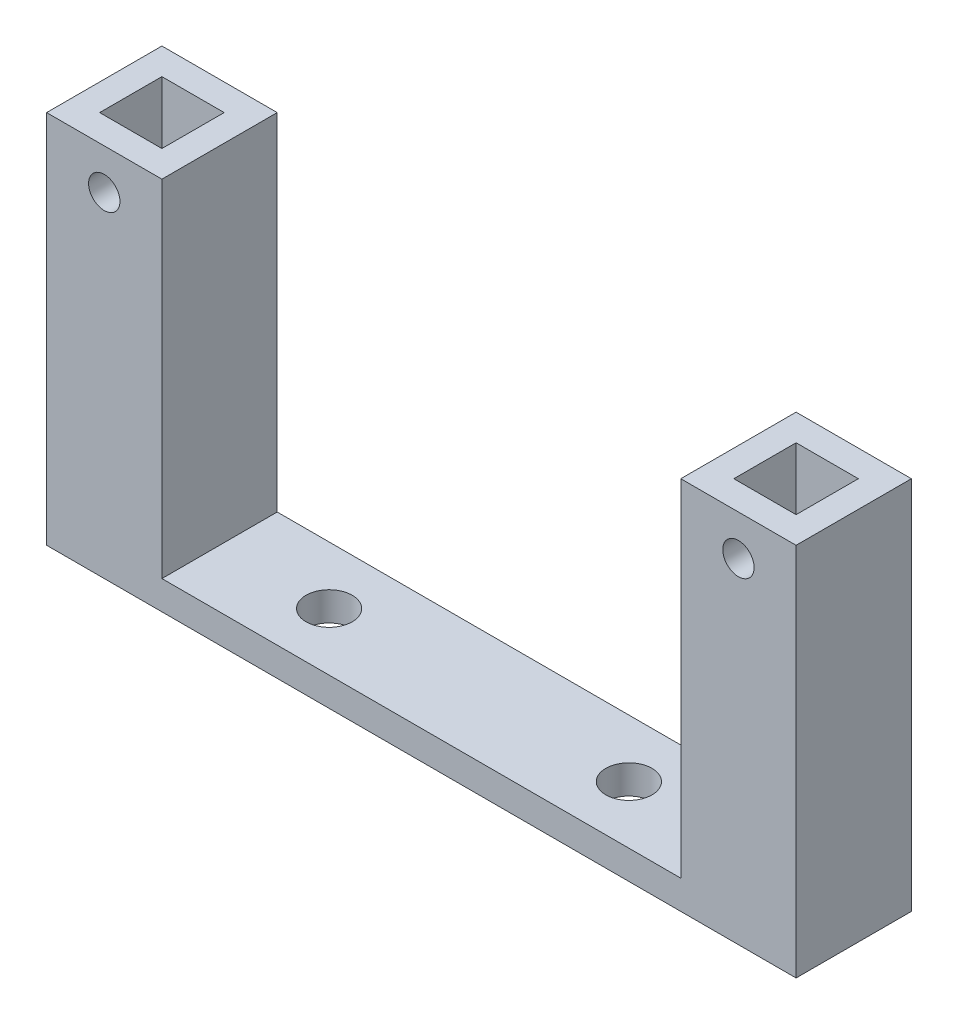
ISO-10303-21;
HEADER;
FILE_DESCRIPTION(('STEP AP214'),'2;1');
FILE_NAME('part.step','',(''),(''),'','','');
FILE_SCHEMA(('AUTOMOTIVE_DESIGN { 1 0 10303 214 1 1 1 1 }'));
ENDSEC;
DATA;
#1=APPLICATION_CONTEXT('core data for automotive mechanical design processes');
#2=APPLICATION_PROTOCOL_DEFINITION('international standard','automotive_design',2000,#1);
#3=PRODUCT_CONTEXT('',#1,'mechanical');
#4=PRODUCT('Part','Part','',(#3));
#5=PRODUCT_RELATED_PRODUCT_CATEGORY('part','',(#4));
#6=PRODUCT_DEFINITION_FORMATION('','',#4);
#7=PRODUCT_DEFINITION_CONTEXT('part definition',#1,'design');
#8=PRODUCT_DEFINITION('design','',#6,#7);
#9=PRODUCT_DEFINITION_SHAPE('','',#8);
#10=(LENGTH_UNIT() NAMED_UNIT(*) SI_UNIT(.MILLI.,.METRE.));
#11=(NAMED_UNIT(*) PLANE_ANGLE_UNIT() SI_UNIT($,.RADIAN.));
#12=(NAMED_UNIT(*) SI_UNIT($,.STERADIAN.) SOLID_ANGLE_UNIT());
#13=UNCERTAINTY_MEASURE_WITH_UNIT(LENGTH_MEASURE(1.E-05),#10,'distance_accuracy_value','');
#14=(GEOMETRIC_REPRESENTATION_CONTEXT(3) GLOBAL_UNCERTAINTY_ASSIGNED_CONTEXT((#13)) GLOBAL_UNIT_ASSIGNED_CONTEXT((#10,
#11,#12)) REPRESENTATION_CONTEXT('',''));
#15=CARTESIAN_POINT('',(0.,0.,0.));
#16=DIRECTION('',(0.,0.,1.));
#17=DIRECTION('',(1.,0.,0.));
#18=AXIS2_PLACEMENT_3D('',#15,#16,#17);
#19=CARTESIAN_POINT('',(0.,3.175,0.));
#20=DIRECTION('',(0.,1.,0.));
#21=DIRECTION('',(0.,0.,1.));
#22=AXIS2_PLACEMENT_3D('',#19,#20,#21);
#23=PLANE('',#22);
#24=CARTESIAN_POINT('',(16.51,3.175,0.));
#25=DIRECTION('',(0.,1.,0.));
#26=DIRECTION('',(0.,0.,1.));
#27=AXIS2_PLACEMENT_3D('',#24,#25,#26);
#28=CIRCLE('',#27,2.54);
#29=CARTESIAN_POINT('',(16.51,3.175,2.54));
#30=VERTEX_POINT('',#29);
#31=EDGE_CURVE('E287',#30,#30,#28,.T.);
#32=ORIENTED_EDGE('',*,*,#31,.F.);
#33=EDGE_LOOP('',(#32));
#34=FACE_BOUND('',#33,.T.);
#35=CARTESIAN_POINT('',(-16.51,3.175,0.));
#36=DIRECTION('',(0.,1.,0.));
#37=DIRECTION('',(0.,0.,1.));
#38=AXIS2_PLACEMENT_3D('',#35,#36,#37);
#39=CIRCLE('',#38,2.54);
#40=CARTESIAN_POINT('',(-16.51,3.175,2.54));
#41=VERTEX_POINT('',#40);
#42=EDGE_CURVE('E176',#41,#41,#39,.T.);
#43=ORIENTED_EDGE('',*,*,#42,.F.);
#44=EDGE_LOOP('',(#43));
#45=FACE_BOUND('',#44,.T.);
#46=DIRECTION('',(1.,0.,0.));
#47=VECTOR('',#46,1.);
#48=CARTESIAN_POINT('',(-41.275,3.175,6.35));
#49=LINE('',#48,#47);
#50=CARTESIAN_POINT('',(-28.575,3.175,6.35));
#51=VERTEX_POINT('',#50);
#52=CARTESIAN_POINT('',(28.575,3.175,6.35));
#53=VERTEX_POINT('',#52);
#54=EDGE_CURVE('E261',#51,#53,#49,.T.);
#55=ORIENTED_EDGE('',*,*,#54,.T.);
#56=DIRECTION('',(0.,0.,1.));
#57=VECTOR('',#56,1.);
#58=CARTESIAN_POINT('',(28.575,3.175,-6.35));
#59=LINE('',#58,#57);
#60=CARTESIAN_POINT('',(28.575,3.175,-6.35));
#61=VERTEX_POINT('',#60);
#62=EDGE_CURVE('E217',#61,#53,#59,.T.);
#63=ORIENTED_EDGE('',*,*,#62,.F.);
#64=DIRECTION('',(-1.,0.,0.));
#65=VECTOR('',#64,1.);
#66=CARTESIAN_POINT('',(-41.275,3.175,-6.35));
#67=LINE('',#66,#65);
#68=CARTESIAN_POINT('',(-28.575,3.175,-6.35));
#69=VERTEX_POINT('',#68);
#70=EDGE_CURVE('E263',#61,#69,#67,.T.);
#71=ORIENTED_EDGE('',*,*,#70,.T.);
#72=DIRECTION('',(0.,0.,-1.));
#73=VECTOR('',#72,1.);
#74=CARTESIAN_POINT('',(-28.575,3.175,-6.35));
#75=LINE('',#74,#73);
#76=EDGE_CURVE('E241',#51,#69,#75,.T.);
#77=ORIENTED_EDGE('',*,*,#76,.F.);
#78=EDGE_LOOP('',(#55,#63,#71,#77));
#79=FACE_BOUND('',#78,.T.);
#80=ADVANCED_FACE('F35',(#34,#45,#79),#23,.T.);
#81=CARTESIAN_POINT('',(-41.275,3.175,-6.35));
#82=DIRECTION('',(1.,0.,0.));
#83=DIRECTION('',(0.,0.,-1.));
#84=AXIS2_PLACEMENT_3D('',#81,#82,#83);
#85=PLANE('',#84);
#86=DIRECTION('',(0.,0.,1.));
#87=VECTOR('',#86,1.);
#88=CARTESIAN_POINT('',(-41.275,0.,-6.35));
#89=LINE('',#88,#87);
#90=CARTESIAN_POINT('',(-41.275,0.,-6.35));
#91=VERTEX_POINT('',#90);
#92=CARTESIAN_POINT('',(-41.275,0.,6.35));
#93=VERTEX_POINT('',#92);
#94=EDGE_CURVE('E260',#91,#93,#89,.T.);
#95=ORIENTED_EDGE('',*,*,#94,.T.);
#96=DIRECTION('',(0.,-1.,0.));
#97=VECTOR('',#96,1.);
#98=CARTESIAN_POINT('',(-41.275,3.175,6.35));
#99=LINE('',#98,#97);
#100=CARTESIAN_POINT('',(-41.275,41.275,6.35));
#101=VERTEX_POINT('',#100);
#102=EDGE_CURVE('E11',#101,#93,#99,.T.);
#103=ORIENTED_EDGE('',*,*,#102,.F.);
#104=DIRECTION('',(0.,0.,1.));
#105=VECTOR('',#104,1.);
#106=CARTESIAN_POINT('',(-41.275,41.275,-6.35));
#107=LINE('',#106,#105);
#108=CARTESIAN_POINT('',(-41.275,41.275,-6.35));
#109=VERTEX_POINT('',#108);
#110=EDGE_CURVE('E242',#109,#101,#107,.T.);
#111=ORIENTED_EDGE('',*,*,#110,.F.);
#112=DIRECTION('',(0.,-1.,0.));
#113=VECTOR('',#112,1.);
#114=CARTESIAN_POINT('',(-41.275,3.175,-6.35));
#115=LINE('',#114,#113);
#116=EDGE_CURVE('E266',#109,#91,#115,.T.);
#117=ORIENTED_EDGE('',*,*,#116,.T.);
#118=EDGE_LOOP('',(#95,#103,#111,#117));
#119=FACE_BOUND('',#118,.T.);
#120=ADVANCED_FACE('F37',(#119),#85,.F.);
#121=CARTESIAN_POINT('',(-41.275,3.175,6.35));
#122=DIRECTION('',(0.,0.,-1.));
#123=DIRECTION('',(-1.,0.,0.));
#124=AXIS2_PLACEMENT_3D('',#121,#122,#123);
#125=PLANE('',#124);
#126=CARTESIAN_POINT('',(-34.925,36.83,6.35));
#127=DIRECTION('',(0.,0.,1.));
#128=DIRECTION('',(1.,0.,0.));
#129=AXIS2_PLACEMENT_3D('',#126,#127,#128);
#130=CIRCLE('',#129,1.72719999999998);
#131=CARTESIAN_POINT('',(-33.1978,36.83,6.35));
#132=VERTEX_POINT('',#131);
#133=EDGE_CURVE('E303',#132,#132,#130,.T.);
#134=ORIENTED_EDGE('',*,*,#133,.F.);
#135=EDGE_LOOP('',(#134));
#136=FACE_BOUND('',#135,.T.);
#137=CARTESIAN_POINT('',(34.925,36.83,6.35));
#138=DIRECTION('',(0.,0.,1.));
#139=DIRECTION('',(1.,0.,0.));
#140=AXIS2_PLACEMENT_3D('',#137,#138,#139);
#141=CIRCLE('',#140,1.72719999999998);
#142=CARTESIAN_POINT('',(36.6522,36.83,6.35));
#143=VERTEX_POINT('',#142);
#144=EDGE_CURVE('E295',#143,#143,#141,.T.);
#145=ORIENTED_EDGE('',*,*,#144,.F.);
#146=EDGE_LOOP('',(#145));
#147=FACE_BOUND('',#146,.T.);
#148=DIRECTION('',(1.,0.,0.));
#149=VECTOR('',#148,1.);
#150=CARTESIAN_POINT('',(-41.275,0.,6.35));
#151=LINE('',#150,#149);
#152=CARTESIAN_POINT('',(41.275,0.,6.35));
#153=VERTEX_POINT('',#152);
#154=EDGE_CURVE('E269',#93,#153,#151,.T.);
#155=ORIENTED_EDGE('',*,*,#154,.T.);
#156=DIRECTION('',(0.,-1.,0.));
#157=VECTOR('',#156,1.);
#158=CARTESIAN_POINT('',(41.275,3.175,6.35));
#159=LINE('',#158,#157);
#160=CARTESIAN_POINT('',(41.275,41.275,6.35));
#161=VERTEX_POINT('',#160);
#162=EDGE_CURVE('E44',#161,#153,#159,.T.);
#163=ORIENTED_EDGE('',*,*,#162,.F.);
#164=DIRECTION('',(1.,0.,0.));
#165=VECTOR('',#164,1.);
#166=CARTESIAN_POINT('',(41.275,41.275,6.35));
#167=LINE('',#166,#165);
#168=CARTESIAN_POINT('',(28.575,41.275,6.35));
#169=VERTEX_POINT('',#168);
#170=EDGE_CURVE('E230',#169,#161,#167,.T.);
#171=ORIENTED_EDGE('',*,*,#170,.F.);
#172=DIRECTION('',(0.,-1.,0.));
#173=VECTOR('',#172,1.);
#174=CARTESIAN_POINT('',(28.575,41.275,6.35));
#175=LINE('',#174,#173);
#176=EDGE_CURVE('E233',#169,#53,#175,.T.);
#177=ORIENTED_EDGE('',*,*,#176,.T.);
#178=ORIENTED_EDGE('',*,*,#54,.F.);
#179=DIRECTION('',(0.,-1.,0.));
#180=VECTOR('',#179,1.);
#181=CARTESIAN_POINT('',(-28.575,41.275,6.35));
#182=LINE('',#181,#180);
#183=CARTESIAN_POINT('',(-28.575,41.275,6.35));
#184=VERTEX_POINT('',#183);
#185=EDGE_CURVE('E257',#184,#51,#182,.T.);
#186=ORIENTED_EDGE('',*,*,#185,.F.);
#187=DIRECTION('',(1.,0.,0.));
#188=VECTOR('',#187,1.);
#189=CARTESIAN_POINT('',(-41.275,41.275,6.35));
#190=LINE('',#189,#188);
#191=EDGE_CURVE('E245',#101,#184,#190,.T.);
#192=ORIENTED_EDGE('',*,*,#191,.F.);
#193=ORIENTED_EDGE('',*,*,#102,.T.);
#194=EDGE_LOOP('',(#155,#163,#171,#177,#178,#186,#192,#193));
#195=FACE_BOUND('',#194,.T.);
#196=ADVANCED_FACE('F309',(#136,#147,#195),#125,.F.);
#197=CARTESIAN_POINT('',(41.275,3.175,-6.35));
#198=DIRECTION('',(-1.,0.,0.));
#199=DIRECTION('',(0.,0.,1.));
#200=AXIS2_PLACEMENT_3D('',#197,#198,#199);
#201=PLANE('',#200);
#202=DIRECTION('',(0.,0.,-1.));
#203=VECTOR('',#202,1.);
#204=CARTESIAN_POINT('',(41.275,0.,-6.35));
#205=LINE('',#204,#203);
#206=CARTESIAN_POINT('',(41.275,0.,-6.35));
#207=VERTEX_POINT('',#206);
#208=EDGE_CURVE('E271',#153,#207,#205,.T.);
#209=ORIENTED_EDGE('',*,*,#208,.T.);
#210=DIRECTION('',(0.,-1.,0.));
#211=VECTOR('',#210,1.);
#212=CARTESIAN_POINT('',(41.275,3.175,-6.35));
#213=LINE('',#212,#211);
#214=CARTESIAN_POINT('',(41.275,41.275,-6.35));
#215=VERTEX_POINT('',#214);
#216=EDGE_CURVE('E276',#215,#207,#213,.T.);
#217=ORIENTED_EDGE('',*,*,#216,.F.);
#218=DIRECTION('',(0.,0.,-1.));
#219=VECTOR('',#218,1.);
#220=CARTESIAN_POINT('',(41.275,41.275,-6.35));
#221=LINE('',#220,#219);
#222=EDGE_CURVE('E223',#161,#215,#221,.T.);
#223=ORIENTED_EDGE('',*,*,#222,.F.);
#224=ORIENTED_EDGE('',*,*,#162,.T.);
#225=EDGE_LOOP('',(#209,#217,#223,#224));
#226=FACE_BOUND('',#225,.T.);
#227=ADVANCED_FACE('F312',(#226),#201,.F.);
#228=CARTESIAN_POINT('',(-41.275,3.175,-6.35));
#229=DIRECTION('',(0.,0.,1.));
#230=DIRECTION('',(1.,0.,0.));
#231=AXIS2_PLACEMENT_3D('',#228,#229,#230);
#232=PLANE('',#231);
#233=DIRECTION('',(-1.,0.,0.));
#234=VECTOR('',#233,1.);
#235=CARTESIAN_POINT('',(-41.275,0.,-6.35));
#236=LINE('',#235,#234);
#237=EDGE_CURVE('E264',#207,#91,#236,.T.);
#238=ORIENTED_EDGE('',*,*,#237,.T.);
#239=ORIENTED_EDGE('',*,*,#116,.F.);
#240=DIRECTION('',(-1.,0.,0.));
#241=VECTOR('',#240,1.);
#242=CARTESIAN_POINT('',(-41.275,41.275,-6.35));
#243=LINE('',#242,#241);
#244=CARTESIAN_POINT('',(-28.575,41.275,-6.35));
#245=VERTEX_POINT('',#244);
#246=EDGE_CURVE('E249',#245,#109,#243,.T.);
#247=ORIENTED_EDGE('',*,*,#246,.F.);
#248=DIRECTION('',(0.,-1.,0.));
#249=VECTOR('',#248,1.);
#250=CARTESIAN_POINT('',(-28.575,41.275,-6.35));
#251=LINE('',#250,#249);
#252=EDGE_CURVE('E252',#245,#69,#251,.T.);
#253=ORIENTED_EDGE('',*,*,#252,.T.);
#254=ORIENTED_EDGE('',*,*,#70,.F.);
#255=DIRECTION('',(0.,-1.,0.));
#256=VECTOR('',#255,1.);
#257=CARTESIAN_POINT('',(28.575,41.275,-6.35));
#258=LINE('',#257,#256);
#259=CARTESIAN_POINT('',(28.575,41.275,-6.35));
#260=VERTEX_POINT('',#259);
#261=EDGE_CURVE('E238',#260,#61,#258,.T.);
#262=ORIENTED_EDGE('',*,*,#261,.F.);
#263=DIRECTION('',(-1.,0.,0.));
#264=VECTOR('',#263,1.);
#265=CARTESIAN_POINT('',(41.275,41.275,-6.35));
#266=LINE('',#265,#264);
#267=EDGE_CURVE('E226',#215,#260,#266,.T.);
#268=ORIENTED_EDGE('',*,*,#267,.F.);
#269=ORIENTED_EDGE('',*,*,#216,.T.);
#270=EDGE_LOOP('',(#238,#239,#247,#253,#254,#262,#268,#269));
#271=FACE_BOUND('',#270,.T.);
#272=ADVANCED_FACE('F325',(#271),#232,.F.);
#273=CARTESIAN_POINT('',(0.,0.,0.));
#274=DIRECTION('',(0.,1.,0.));
#275=DIRECTION('',(0.,0.,1.));
#276=AXIS2_PLACEMENT_3D('',#273,#274,#275);
#277=PLANE('',#276);
#278=CARTESIAN_POINT('',(16.51,0.,0.));
#279=DIRECTION('',(0.,1.,0.));
#280=DIRECTION('',(0.,0.,1.));
#281=AXIS2_PLACEMENT_3D('',#278,#279,#280);
#282=CIRCLE('',#281,2.54);
#283=CARTESIAN_POINT('',(16.51,0.,2.54));
#284=VERTEX_POINT('',#283);
#285=EDGE_CURVE('E39',#284,#284,#282,.T.);
#286=ORIENTED_EDGE('',*,*,#285,.T.);
#287=EDGE_LOOP('',(#286));
#288=FACE_BOUND('',#287,.T.);
#289=CARTESIAN_POINT('',(-16.51,0.,0.));
#290=DIRECTION('',(0.,1.,0.));
#291=DIRECTION('',(0.,0.,1.));
#292=AXIS2_PLACEMENT_3D('',#289,#290,#291);
#293=CIRCLE('',#292,2.54);
#294=CARTESIAN_POINT('',(-16.51,0.,2.54));
#295=VERTEX_POINT('',#294);
#296=EDGE_CURVE('E183',#295,#295,#293,.T.);
#297=ORIENTED_EDGE('',*,*,#296,.T.);
#298=EDGE_LOOP('',(#297));
#299=FACE_BOUND('',#298,.T.);
#300=ORIENTED_EDGE('',*,*,#94,.F.);
#301=ORIENTED_EDGE('',*,*,#237,.F.);
#302=ORIENTED_EDGE('',*,*,#208,.F.);
#303=ORIENTED_EDGE('',*,*,#154,.F.);
#304=EDGE_LOOP('',(#300,#301,#302,#303));
#305=FACE_BOUND('',#304,.T.);
#306=ADVANCED_FACE('F323',(#288,#299,#305),#277,.F.);
#307=CARTESIAN_POINT('',(-28.575,41.275,-6.35));
#308=DIRECTION('',(-1.,0.,0.));
#309=DIRECTION('',(0.,0.,1.));
#310=AXIS2_PLACEMENT_3D('',#307,#308,#309);
#311=PLANE('',#310);
#312=ORIENTED_EDGE('',*,*,#76,.T.);
#313=ORIENTED_EDGE('',*,*,#252,.F.);
#314=DIRECTION('',(0.,0.,-1.));
#315=VECTOR('',#314,1.);
#316=CARTESIAN_POINT('',(-28.575,41.275,-6.35));
#317=LINE('',#316,#315);
#318=EDGE_CURVE('E247',#184,#245,#317,.T.);
#319=ORIENTED_EDGE('',*,*,#318,.F.);
#320=ORIENTED_EDGE('',*,*,#185,.T.);
#321=EDGE_LOOP('',(#312,#313,#319,#320));
#322=FACE_BOUND('',#321,.T.);
#323=ADVANCED_FACE('F338',(#322),#311,.F.);
#324=CARTESIAN_POINT('',(0.,41.275,0.));
#325=DIRECTION('',(0.,1.,0.));
#326=DIRECTION('',(0.,0.,1.));
#327=AXIS2_PLACEMENT_3D('',#324,#325,#326);
#328=PLANE('',#327);
#329=DIRECTION('',(0.,0.,1.));
#330=VECTOR('',#329,1.);
#331=CARTESIAN_POINT('',(-38.354,41.275,-3.429));
#332=LINE('',#331,#330);
#333=CARTESIAN_POINT('',(-38.354,41.275,-3.429));
#334=VERTEX_POINT('',#333);
#335=CARTESIAN_POINT('',(-38.354,41.275,3.429));
#336=VERTEX_POINT('',#335);
#337=EDGE_CURVE('E60',#334,#336,#332,.T.);
#338=ORIENTED_EDGE('',*,*,#337,.F.);
#339=DIRECTION('',(-1.,0.,0.));
#340=VECTOR('',#339,1.);
#341=CARTESIAN_POINT('',(-38.354,41.275,-3.429));
#342=LINE('',#341,#340);
#343=CARTESIAN_POINT('',(-31.496,41.275,-3.429));
#344=VERTEX_POINT('',#343);
#345=EDGE_CURVE('E196',#344,#334,#342,.T.);
#346=ORIENTED_EDGE('',*,*,#345,.F.);
#347=DIRECTION('',(0.,0.,-1.));
#348=VECTOR('',#347,1.);
#349=CARTESIAN_POINT('',(-31.496,41.275,-3.429));
#350=LINE('',#349,#348);
#351=CARTESIAN_POINT('',(-31.496,41.275,3.429));
#352=VERTEX_POINT('',#351);
#353=EDGE_CURVE('E210',#352,#344,#350,.T.);
#354=ORIENTED_EDGE('',*,*,#353,.F.);
#355=DIRECTION('',(1.,0.,0.));
#356=VECTOR('',#355,1.);
#357=CARTESIAN_POINT('',(-38.354,41.275,3.429));
#358=LINE('',#357,#356);
#359=EDGE_CURVE('E207',#336,#352,#358,.T.);
#360=ORIENTED_EDGE('',*,*,#359,.F.);
#361=EDGE_LOOP('',(#338,#346,#354,#360));
#362=FACE_BOUND('',#361,.T.);
#363=ORIENTED_EDGE('',*,*,#110,.T.);
#364=ORIENTED_EDGE('',*,*,#191,.T.);
#365=ORIENTED_EDGE('',*,*,#318,.T.);
#366=ORIENTED_EDGE('',*,*,#246,.T.);
#367=EDGE_LOOP('',(#363,#364,#365,#366));
#368=FACE_BOUND('',#367,.T.);
#369=ADVANCED_FACE('F331',(#362,#368),#328,.T.);
#370=CARTESIAN_POINT('',(28.575,41.275,-6.35));
#371=DIRECTION('',(1.,0.,0.));
#372=DIRECTION('',(0.,0.,-1.));
#373=AXIS2_PLACEMENT_3D('',#370,#371,#372);
#374=PLANE('',#373);
#375=ORIENTED_EDGE('',*,*,#62,.T.);
#376=ORIENTED_EDGE('',*,*,#176,.F.);
#377=DIRECTION('',(0.,0.,1.));
#378=VECTOR('',#377,1.);
#379=CARTESIAN_POINT('',(28.575,41.275,-6.35));
#380=LINE('',#379,#378);
#381=EDGE_CURVE('E228',#260,#169,#380,.T.);
#382=ORIENTED_EDGE('',*,*,#381,.F.);
#383=ORIENTED_EDGE('',*,*,#261,.T.);
#384=EDGE_LOOP('',(#375,#376,#382,#383));
#385=FACE_BOUND('',#384,.T.);
#386=ADVANCED_FACE('F344',(#385),#374,.F.);
#387=CARTESIAN_POINT('',(0.,41.275,0.));
#388=DIRECTION('',(0.,-1.,0.));
#389=DIRECTION('',(0.,0.,-1.));
#390=AXIS2_PLACEMENT_3D('',#387,#388,#389);
#391=PLANE('',#390);
#392=DIRECTION('',(1.,0.,0.));
#393=VECTOR('',#392,1.);
#394=CARTESIAN_POINT('',(31.496,41.275,3.429));
#395=LINE('',#394,#393);
#396=CARTESIAN_POINT('',(31.496,41.275,3.429));
#397=VERTEX_POINT('',#396);
#398=CARTESIAN_POINT('',(38.354,41.275,3.429));
#399=VERTEX_POINT('',#398);
#400=EDGE_CURVE('E182',#397,#399,#395,.T.);
#401=ORIENTED_EDGE('',*,*,#400,.F.);
#402=DIRECTION('',(0.,0.,1.));
#403=VECTOR('',#402,1.);
#404=CARTESIAN_POINT('',(31.496,41.275,-3.429));
#405=LINE('',#404,#403);
#406=CARTESIAN_POINT('',(31.496,41.275,-3.429));
#407=VERTEX_POINT('',#406);
#408=EDGE_CURVE('E52',#407,#397,#405,.T.);
#409=ORIENTED_EDGE('',*,*,#408,.F.);
#410=DIRECTION('',(-1.,0.,0.));
#411=VECTOR('',#410,1.);
#412=CARTESIAN_POINT('',(31.496,41.275,-3.429));
#413=LINE('',#412,#411);
#414=CARTESIAN_POINT('',(38.354,41.275,-3.429));
#415=VERTEX_POINT('',#414);
#416=EDGE_CURVE('E170',#415,#407,#413,.T.);
#417=ORIENTED_EDGE('',*,*,#416,.F.);
#418=DIRECTION('',(0.,0.,-1.));
#419=VECTOR('',#418,1.);
#420=CARTESIAN_POINT('',(38.354,41.275,-3.429));
#421=LINE('',#420,#419);
#422=EDGE_CURVE('E173',#399,#415,#421,.T.);
#423=ORIENTED_EDGE('',*,*,#422,.F.);
#424=EDGE_LOOP('',(#401,#409,#417,#423));
#425=FACE_BOUND('',#424,.T.);
#426=ORIENTED_EDGE('',*,*,#222,.T.);
#427=ORIENTED_EDGE('',*,*,#267,.T.);
#428=ORIENTED_EDGE('',*,*,#381,.T.);
#429=ORIENTED_EDGE('',*,*,#170,.T.);
#430=EDGE_LOOP('',(#426,#427,#428,#429));
#431=FACE_BOUND('',#430,.T.);
#432=ADVANCED_FACE('F346',(#425,#431),#391,.F.);
#433=CARTESIAN_POINT('',(-38.354,3.175,-3.429));
#434=DIRECTION('',(-1.,0.,0.));
#435=DIRECTION('',(0.,0.,1.));
#436=AXIS2_PLACEMENT_3D('',#433,#434,#435);
#437=PLANE('',#436);
#438=ORIENTED_EDGE('',*,*,#337,.T.);
#439=DIRECTION('',(0.,1.,0.));
#440=VECTOR('',#439,1.);
#441=CARTESIAN_POINT('',(-38.354,3.175,3.429));
#442=LINE('',#441,#440);
#443=CARTESIAN_POINT('',(-38.354,3.175,3.429));
#444=VERTEX_POINT('',#443);
#445=EDGE_CURVE('E205',#444,#336,#442,.T.);
#446=ORIENTED_EDGE('',*,*,#445,.F.);
#447=DIRECTION('',(0.,0.,1.));
#448=VECTOR('',#447,1.);
#449=CARTESIAN_POINT('',(-38.354,3.175,-3.429));
#450=LINE('',#449,#448);
#451=CARTESIAN_POINT('',(-38.354,3.175,-3.429));
#452=VERTEX_POINT('',#451);
#453=EDGE_CURVE('E192',#452,#444,#450,.T.);
#454=ORIENTED_EDGE('',*,*,#453,.F.);
#455=DIRECTION('',(0.,1.,0.));
#456=VECTOR('',#455,1.);
#457=CARTESIAN_POINT('',(-38.354,3.175,-3.429));
#458=LINE('',#457,#456);
#459=EDGE_CURVE('E215',#452,#334,#458,.T.);
#460=ORIENTED_EDGE('',*,*,#459,.T.);
#461=EDGE_LOOP('',(#438,#446,#454,#460));
#462=FACE_BOUND('',#461,.T.);
#463=ADVANCED_FACE('F348',(#462),#437,.F.);
#464=CARTESIAN_POINT('',(-38.354,3.175,-3.429));
#465=DIRECTION('',(0.,0.,-1.));
#466=DIRECTION('',(-1.,0.,0.));
#467=AXIS2_PLACEMENT_3D('',#464,#465,#466);
#468=PLANE('',#467);
#469=ORIENTED_EDGE('',*,*,#345,.T.);
#470=ORIENTED_EDGE('',*,*,#459,.F.);
#471=DIRECTION('',(-1.,0.,0.));
#472=VECTOR('',#471,1.);
#473=CARTESIAN_POINT('',(-38.354,3.175,-3.429));
#474=LINE('',#473,#472);
#475=CARTESIAN_POINT('',(-31.496,3.175,-3.429));
#476=VERTEX_POINT('',#475);
#477=EDGE_CURVE('E202',#476,#452,#474,.T.);
#478=ORIENTED_EDGE('',*,*,#477,.F.);
#479=DIRECTION('',(0.,1.,0.));
#480=VECTOR('',#479,1.);
#481=CARTESIAN_POINT('',(-31.496,3.175,-3.429));
#482=LINE('',#481,#480);
#483=EDGE_CURVE('E218',#476,#344,#482,.T.);
#484=ORIENTED_EDGE('',*,*,#483,.T.);
#485=EDGE_LOOP('',(#469,#470,#478,#484));
#486=FACE_BOUND('',#485,.T.);
#487=ADVANCED_FACE('F355',(#486),#468,.F.);
#488=CARTESIAN_POINT('',(-31.496,3.175,-3.429));
#489=DIRECTION('',(1.,0.,0.));
#490=DIRECTION('',(0.,0.,-1.));
#491=AXIS2_PLACEMENT_3D('',#488,#489,#490);
#492=PLANE('',#491);
#493=ORIENTED_EDGE('',*,*,#353,.T.);
#494=ORIENTED_EDGE('',*,*,#483,.F.);
#495=DIRECTION('',(0.,0.,-1.));
#496=VECTOR('',#495,1.);
#497=CARTESIAN_POINT('',(-31.496,3.175,-3.429));
#498=LINE('',#497,#496);
#499=CARTESIAN_POINT('',(-31.496,3.175,3.429));
#500=VERTEX_POINT('',#499);
#501=EDGE_CURVE('E199',#500,#476,#498,.T.);
#502=ORIENTED_EDGE('',*,*,#501,.F.);
#503=DIRECTION('',(0.,1.,0.));
#504=VECTOR('',#503,1.);
#505=CARTESIAN_POINT('',(-31.496,3.175,3.429));
#506=LINE('',#505,#504);
#507=EDGE_CURVE('E220',#500,#352,#506,.T.);
#508=ORIENTED_EDGE('',*,*,#507,.T.);
#509=EDGE_LOOP('',(#493,#494,#502,#508));
#510=FACE_BOUND('',#509,.T.);
#511=ADVANCED_FACE('F427',(#510),#492,.F.);
#512=CARTESIAN_POINT('',(-38.354,3.175,3.429));
#513=DIRECTION('',(0.,0.,1.));
#514=DIRECTION('',(1.,0.,0.));
#515=AXIS2_PLACEMENT_3D('',#512,#513,#514);
#516=PLANE('',#515);
#517=CARTESIAN_POINT('',(-34.925,36.83,3.429));
#518=DIRECTION('',(0.,0.,1.));
#519=DIRECTION('',(1.,0.,0.));
#520=AXIS2_PLACEMENT_3D('',#517,#518,#519);
#521=CIRCLE('',#520,1.72719999999999);
#522=CARTESIAN_POINT('',(-33.1978,36.83,3.429));
#523=VERTEX_POINT('',#522);
#524=EDGE_CURVE('E300',#523,#523,#521,.T.);
#525=ORIENTED_EDGE('',*,*,#524,.T.);
#526=EDGE_LOOP('',(#525));
#527=FACE_BOUND('',#526,.T.);
#528=ORIENTED_EDGE('',*,*,#359,.T.);
#529=ORIENTED_EDGE('',*,*,#507,.F.);
#530=DIRECTION('',(1.,0.,0.));
#531=VECTOR('',#530,1.);
#532=CARTESIAN_POINT('',(-38.354,3.175,3.429));
#533=LINE('',#532,#531);
#534=EDGE_CURVE('E195',#444,#500,#533,.T.);
#535=ORIENTED_EDGE('',*,*,#534,.F.);
#536=ORIENTED_EDGE('',*,*,#445,.T.);
#537=EDGE_LOOP('',(#528,#529,#535,#536));
#538=FACE_BOUND('',#537,.T.);
#539=ADVANCED_FACE('F436',(#527,#538),#516,.F.);
#540=CARTESIAN_POINT('',(0.,3.175,0.));
#541=DIRECTION('',(0.,1.,0.));
#542=DIRECTION('',(0.,0.,1.));
#543=AXIS2_PLACEMENT_3D('',#540,#541,#542);
#544=PLANE('',#543);
#545=ORIENTED_EDGE('',*,*,#453,.T.);
#546=ORIENTED_EDGE('',*,*,#534,.T.);
#547=ORIENTED_EDGE('',*,*,#501,.T.);
#548=ORIENTED_EDGE('',*,*,#477,.T.);
#549=EDGE_LOOP('',(#545,#546,#547,#548));
#550=FACE_BOUND('',#549,.T.);
#551=ADVANCED_FACE('F445',(#550),#544,.T.);
#552=CARTESIAN_POINT('',(31.496,3.175,-3.429));
#553=DIRECTION('',(-1.,0.,0.));
#554=DIRECTION('',(0.,0.,1.));
#555=AXIS2_PLACEMENT_3D('',#552,#553,#554);
#556=PLANE('',#555);
#557=ORIENTED_EDGE('',*,*,#408,.T.);
#558=DIRECTION('',(0.,1.,0.));
#559=VECTOR('',#558,1.);
#560=CARTESIAN_POINT('',(31.496,3.175,3.429));
#561=LINE('',#560,#559);
#562=CARTESIAN_POINT('',(31.496,3.175,3.429));
#563=VERTEX_POINT('',#562);
#564=EDGE_CURVE('E148',#563,#397,#561,.T.);
#565=ORIENTED_EDGE('',*,*,#564,.F.);
#566=DIRECTION('',(0.,0.,1.));
#567=VECTOR('',#566,1.);
#568=CARTESIAN_POINT('',(31.496,3.175,-3.429));
#569=LINE('',#568,#567);
#570=CARTESIAN_POINT('',(31.496,3.175,-3.429));
#571=VERTEX_POINT('',#570);
#572=EDGE_CURVE('E152',#571,#563,#569,.T.);
#573=ORIENTED_EDGE('',*,*,#572,.F.);
#574=DIRECTION('',(0.,1.,0.));
#575=VECTOR('',#574,1.);
#576=CARTESIAN_POINT('',(31.496,3.175,-3.429));
#577=LINE('',#576,#575);
#578=EDGE_CURVE('E187',#571,#407,#577,.T.);
#579=ORIENTED_EDGE('',*,*,#578,.T.);
#580=EDGE_LOOP('',(#557,#565,#573,#579));
#581=FACE_BOUND('',#580,.T.);
#582=ADVANCED_FACE('F150',(#581),#556,.F.);
#583=CARTESIAN_POINT('',(31.496,3.175,-3.429));
#584=DIRECTION('',(0.,0.,-1.));
#585=DIRECTION('',(-1.,0.,0.));
#586=AXIS2_PLACEMENT_3D('',#583,#584,#585);
#587=PLANE('',#586);
#588=ORIENTED_EDGE('',*,*,#416,.T.);
#589=ORIENTED_EDGE('',*,*,#578,.F.);
#590=DIRECTION('',(-1.,0.,0.));
#591=VECTOR('',#590,1.);
#592=CARTESIAN_POINT('',(31.496,3.175,-3.429));
#593=LINE('',#592,#591);
#594=CARTESIAN_POINT('',(38.354,3.175,-3.429));
#595=VERTEX_POINT('',#594);
#596=EDGE_CURVE('E158',#595,#571,#593,.T.);
#597=ORIENTED_EDGE('',*,*,#596,.F.);
#598=DIRECTION('',(0.,1.,0.));
#599=VECTOR('',#598,1.);
#600=CARTESIAN_POINT('',(38.354,3.175,-3.429));
#601=LINE('',#600,#599);
#602=EDGE_CURVE('E189',#595,#415,#601,.T.);
#603=ORIENTED_EDGE('',*,*,#602,.T.);
#604=EDGE_LOOP('',(#588,#589,#597,#603));
#605=FACE_BOUND('',#604,.T.);
#606=ADVANCED_FACE('F460',(#605),#587,.F.);
#607=CARTESIAN_POINT('',(38.354,3.175,-3.429));
#608=DIRECTION('',(1.,0.,0.));
#609=DIRECTION('',(0.,0.,-1.));
#610=AXIS2_PLACEMENT_3D('',#607,#608,#609);
#611=PLANE('',#610);
#612=ORIENTED_EDGE('',*,*,#422,.T.);
#613=ORIENTED_EDGE('',*,*,#602,.F.);
#614=DIRECTION('',(0.,0.,-1.));
#615=VECTOR('',#614,1.);
#616=CARTESIAN_POINT('',(38.354,3.175,-3.429));
#617=LINE('',#616,#615);
#618=CARTESIAN_POINT('',(38.354,3.175,3.429));
#619=VERTEX_POINT('',#618);
#620=EDGE_CURVE('E166',#619,#595,#617,.T.);
#621=ORIENTED_EDGE('',*,*,#620,.F.);
#622=DIRECTION('',(0.,1.,0.));
#623=VECTOR('',#622,1.);
#624=CARTESIAN_POINT('',(38.354,3.175,3.429));
#625=LINE('',#624,#623);
#626=EDGE_CURVE('E157',#619,#399,#625,.T.);
#627=ORIENTED_EDGE('',*,*,#626,.T.);
#628=EDGE_LOOP('',(#612,#613,#621,#627));
#629=FACE_BOUND('',#628,.T.);
#630=ADVANCED_FACE('F468',(#629),#611,.F.);
#631=CARTESIAN_POINT('',(31.496,3.175,3.429));
#632=DIRECTION('',(0.,0.,1.));
#633=DIRECTION('',(1.,0.,0.));
#634=AXIS2_PLACEMENT_3D('',#631,#632,#633);
#635=PLANE('',#634);
#636=CARTESIAN_POINT('',(34.925,36.83,3.429));
#637=DIRECTION('',(0.,0.,1.));
#638=DIRECTION('',(1.,0.,0.));
#639=AXIS2_PLACEMENT_3D('',#636,#637,#638);
#640=CIRCLE('',#639,1.72719999999999);
#641=CARTESIAN_POINT('',(36.6522,36.83,3.429));
#642=VERTEX_POINT('',#641);
#643=EDGE_CURVE('E291',#642,#642,#640,.T.);
#644=ORIENTED_EDGE('',*,*,#643,.T.);
#645=EDGE_LOOP('',(#644));
#646=FACE_BOUND('',#645,.T.);
#647=ORIENTED_EDGE('',*,*,#400,.T.);
#648=ORIENTED_EDGE('',*,*,#626,.F.);
#649=DIRECTION('',(1.,0.,0.));
#650=VECTOR('',#649,1.);
#651=CARTESIAN_POINT('',(31.496,3.175,3.429));
#652=LINE('',#651,#650);
#653=EDGE_CURVE('E161',#563,#619,#652,.T.);
#654=ORIENTED_EDGE('',*,*,#653,.F.);
#655=ORIENTED_EDGE('',*,*,#564,.T.);
#656=EDGE_LOOP('',(#647,#648,#654,#655));
#657=FACE_BOUND('',#656,.T.);
#658=ADVANCED_FACE('F162',(#646,#657),#635,.F.);
#659=CARTESIAN_POINT('',(0.,3.175,0.));
#660=DIRECTION('',(0.,1.,0.));
#661=DIRECTION('',(0.,0.,1.));
#662=AXIS2_PLACEMENT_3D('',#659,#660,#661);
#663=PLANE('',#662);
#664=ORIENTED_EDGE('',*,*,#572,.T.);
#665=ORIENTED_EDGE('',*,*,#653,.T.);
#666=ORIENTED_EDGE('',*,*,#620,.T.);
#667=ORIENTED_EDGE('',*,*,#596,.T.);
#668=EDGE_LOOP('',(#664,#665,#666,#667));
#669=FACE_BOUND('',#668,.T.);
#670=ADVANCED_FACE('F168',(#669),#663,.T.);
#671=CARTESIAN_POINT('',(-16.51,-34.925,0.));
#672=DIRECTION('',(0.,1.,0.));
#673=DIRECTION('',(0.,0.,1.));
#674=AXIS2_PLACEMENT_3D('',#671,#672,#673);
#675=CYLINDRICAL_SURFACE('',#674,2.54);
#676=CARTESIAN_POINT('',(-16.51,3.175,2.54));
#677=CARTESIAN_POINT('',(-16.51,3.14192708333333,2.54));
#678=CARTESIAN_POINT('',(-16.51,3.10885416666667,2.54));
#679=CARTESIAN_POINT('',(-16.51,3.04270833333333,2.54));
#680=CARTESIAN_POINT('',(-16.51,3.00963541666666,2.54));
#681=CARTESIAN_POINT('',(-16.51,2.94348958333333,2.54));
#682=CARTESIAN_POINT('',(-16.51,2.91041666666666,2.54));
#683=CARTESIAN_POINT('',(-16.51,2.84427083333333,2.54));
#684=CARTESIAN_POINT('',(-16.51,2.81119791666667,2.54));
#685=CARTESIAN_POINT('',(-16.51,2.74505208333333,2.54));
#686=CARTESIAN_POINT('',(-16.51,2.71197916666666,2.54));
#687=CARTESIAN_POINT('',(-16.51,2.64583333333333,2.54));
#688=CARTESIAN_POINT('',(-16.51,2.61276041666666,2.54));
#689=CARTESIAN_POINT('',(-16.51,2.54661458333333,2.54));
#690=CARTESIAN_POINT('',(-16.51,2.51354166666667,2.54));
#691=CARTESIAN_POINT('',(-16.51,2.44739583333333,2.54));
#692=CARTESIAN_POINT('',(-16.51,2.41432291666667,2.54));
#693=CARTESIAN_POINT('',(-16.51,2.34817708333333,2.54));
#694=CARTESIAN_POINT('',(-16.51,2.31510416666667,2.54));
#695=CARTESIAN_POINT('',(-16.51,2.24895833333333,2.54));
#696=CARTESIAN_POINT('',(-16.51,2.21588541666666,2.54));
#697=CARTESIAN_POINT('',(-16.51,2.14973958333333,2.54));
#698=CARTESIAN_POINT('',(-16.51,2.11666666666667,2.54));
#699=CARTESIAN_POINT('',(-16.51,2.05052083333333,2.54));
#700=CARTESIAN_POINT('',(-16.51,2.01744791666667,2.54));
#701=CARTESIAN_POINT('',(-16.51,1.95130208333333,2.54));
#702=CARTESIAN_POINT('',(-16.51,1.91822916666666,2.54));
#703=CARTESIAN_POINT('',(-16.51,1.85208333333333,2.54));
#704=CARTESIAN_POINT('',(-16.51,1.81901041666667,2.54));
#705=CARTESIAN_POINT('',(-16.51,1.75286458333333,2.54));
#706=CARTESIAN_POINT('',(-16.51,1.71979166666666,2.54));
#707=CARTESIAN_POINT('',(-16.51,1.65364583333333,2.54));
#708=CARTESIAN_POINT('',(-16.51,1.62057291666666,2.54));
#709=CARTESIAN_POINT('',(-16.51,1.55442708333333,2.54));
#710=CARTESIAN_POINT('',(-16.51,1.52135416666667,2.54));
#711=CARTESIAN_POINT('',(-16.51,1.45520833333333,2.54));
#712=CARTESIAN_POINT('',(-16.51,1.42213541666666,2.54));
#713=CARTESIAN_POINT('',(-16.51,1.35598958333333,2.54));
#714=CARTESIAN_POINT('',(-16.51,1.32291666666666,2.54));
#715=CARTESIAN_POINT('',(-16.51,1.25677083333333,2.54));
#716=CARTESIAN_POINT('',(-16.51,1.22369791666667,2.54));
#717=CARTESIAN_POINT('',(-16.51,1.15755208333333,2.54));
#718=CARTESIAN_POINT('',(-16.51,1.12447916666666,2.54));
#719=CARTESIAN_POINT('',(-16.51,1.05833333333333,2.54));
#720=CARTESIAN_POINT('',(-16.51,1.02526041666666,2.54));
#721=CARTESIAN_POINT('',(-16.51,0.959114583333332,2.54));
#722=CARTESIAN_POINT('',(-16.51,0.926041666666666,2.54));
#723=CARTESIAN_POINT('',(-16.51,0.859895833333332,2.54));
#724=CARTESIAN_POINT('',(-16.51,0.826822916666664,2.54));
#725=CARTESIAN_POINT('',(-16.51,0.76067708333333,2.54));
#726=CARTESIAN_POINT('',(-16.51,0.727604166666664,2.54));
#727=CARTESIAN_POINT('',(-16.51,0.661458333333332,2.54));
#728=CARTESIAN_POINT('',(-16.51,0.628385416666666,2.54));
#729=CARTESIAN_POINT('',(-16.51,0.562239583333334,2.54));
#730=CARTESIAN_POINT('',(-16.51,0.529166666666669,2.54));
#731=CARTESIAN_POINT('',(-16.51,0.463020833333334,2.54));
#732=CARTESIAN_POINT('',(-16.51,0.429947916666666,2.54));
#733=CARTESIAN_POINT('',(-16.51,0.363802083333332,2.54));
#734=CARTESIAN_POINT('',(-16.51,0.330729166666666,2.54));
#735=CARTESIAN_POINT('',(-16.51,0.264583333333334,2.54));
#736=CARTESIAN_POINT('',(-16.51,0.231510416666668,2.54));
#737=CARTESIAN_POINT('',(-16.51,0.165364583333334,2.54));
#738=CARTESIAN_POINT('',(-16.51,0.132291666666666,2.54));
#739=CARTESIAN_POINT('',(-16.51,0.0661458333333318,2.54));
#740=CARTESIAN_POINT('',(-16.51,0.0330729166666659,2.54));
#741=CARTESIAN_POINT('',(-16.51,0.,2.54));
#742=B_SPLINE_CURVE_WITH_KNOTS('',3,(#676,#677,#678,#679,#680,#681,#682,#683,#684,#685,#686,
#687,#688,#689,#690,#691,#692,#693,#694,#695,#696,#697,#698,#699,#700,#701,#702,#703,#704,#705,
#706,#707,#708,#709,#710,#711,#712,#713,#714,#715,#716,#717,#718,#719,#720,#721,#722,#723,#724,
#725,#726,#727,#728,#729,#730,#731,#732,#733,#734,#735,#736,#737,#738,#739,#740,#741),
.UNSPECIFIED.,.F.,.F.,(4,2,2,2,2,2,2,2,2,2,2,2,2,2,2,2,2,2,2,2,2,2,2,2,2,2,2,2,2,2,2,2,4),(0.,
0.0992187499999977,0.198437500000002,0.29765625,0.396874999999998,0.496093750000003,0.5953125,
0.694531249999998,0.793749999999996,0.892968750000001,0.992187499999998,1.09140625,1.190625,
1.28984375,1.3890625,1.48828125,1.5875,1.68671875,1.7859375,1.88515625,1.984375,2.08359375,
2.1828125,2.28203125,2.38125,2.48046875,2.5796875,2.67890624999999,2.778125,2.87734375,
2.97656249999999,3.07578125,3.175),.UNSPECIFIED.);
#743=EDGE_CURVE('BSEAM493',#41,#295,#742,.T.);
#744=ORIENTED_EDGE('',*,*,#42,.T.);
#745=ORIENTED_EDGE('',*,*,#296,.F.);
#746=ORIENTED_EDGE('',*,*,#743,.T.);
#747=ORIENTED_EDGE('',*,*,#743,.F.);
#748=EDGE_LOOP('',(#744,#746,#745,#747));
#749=FACE_BOUND('',#748,.T.);
#750=ADVANCED_FACE('F493',(#749),#675,.F.);
#751=CARTESIAN_POINT('',(16.51,-34.925,0.));
#752=DIRECTION('',(0.,1.,0.));
#753=DIRECTION('',(0.,0.,1.));
#754=AXIS2_PLACEMENT_3D('',#751,#752,#753);
#755=CYLINDRICAL_SURFACE('',#754,2.54);
#756=CARTESIAN_POINT('',(16.51,3.175,2.54));
#757=CARTESIAN_POINT('',(16.51,3.14192708333333,2.54));
#758=CARTESIAN_POINT('',(16.51,3.10885416666667,2.54));
#759=CARTESIAN_POINT('',(16.51,3.04270833333333,2.54));
#760=CARTESIAN_POINT('',(16.51,3.00963541666666,2.54));
#761=CARTESIAN_POINT('',(16.51,2.94348958333333,2.54));
#762=CARTESIAN_POINT('',(16.51,2.91041666666666,2.54));
#763=CARTESIAN_POINT('',(16.51,2.84427083333333,2.54));
#764=CARTESIAN_POINT('',(16.51,2.81119791666667,2.54));
#765=CARTESIAN_POINT('',(16.51,2.74505208333333,2.54));
#766=CARTESIAN_POINT('',(16.51,2.71197916666666,2.54));
#767=CARTESIAN_POINT('',(16.51,2.64583333333333,2.54));
#768=CARTESIAN_POINT('',(16.51,2.61276041666666,2.54));
#769=CARTESIAN_POINT('',(16.51,2.54661458333333,2.54));
#770=CARTESIAN_POINT('',(16.51,2.51354166666667,2.54));
#771=CARTESIAN_POINT('',(16.51,2.44739583333333,2.54));
#772=CARTESIAN_POINT('',(16.51,2.41432291666667,2.54));
#773=CARTESIAN_POINT('',(16.51,2.34817708333333,2.54));
#774=CARTESIAN_POINT('',(16.51,2.31510416666667,2.54));
#775=CARTESIAN_POINT('',(16.51,2.24895833333333,2.54));
#776=CARTESIAN_POINT('',(16.51,2.21588541666666,2.54));
#777=CARTESIAN_POINT('',(16.51,2.14973958333333,2.54));
#778=CARTESIAN_POINT('',(16.51,2.11666666666667,2.54));
#779=CARTESIAN_POINT('',(16.51,2.05052083333333,2.54));
#780=CARTESIAN_POINT('',(16.51,2.01744791666667,2.54));
#781=CARTESIAN_POINT('',(16.51,1.95130208333333,2.54));
#782=CARTESIAN_POINT('',(16.51,1.91822916666666,2.54));
#783=CARTESIAN_POINT('',(16.51,1.85208333333333,2.54));
#784=CARTESIAN_POINT('',(16.51,1.81901041666667,2.54));
#785=CARTESIAN_POINT('',(16.51,1.75286458333333,2.54));
#786=CARTESIAN_POINT('',(16.51,1.71979166666666,2.54));
#787=CARTESIAN_POINT('',(16.51,1.65364583333333,2.54));
#788=CARTESIAN_POINT('',(16.51,1.62057291666666,2.54));
#789=CARTESIAN_POINT('',(16.51,1.55442708333333,2.54));
#790=CARTESIAN_POINT('',(16.51,1.52135416666667,2.54));
#791=CARTESIAN_POINT('',(16.51,1.45520833333333,2.54));
#792=CARTESIAN_POINT('',(16.51,1.42213541666666,2.54));
#793=CARTESIAN_POINT('',(16.51,1.35598958333333,2.54));
#794=CARTESIAN_POINT('',(16.51,1.32291666666666,2.54));
#795=CARTESIAN_POINT('',(16.51,1.25677083333333,2.54));
#796=CARTESIAN_POINT('',(16.51,1.22369791666667,2.54));
#797=CARTESIAN_POINT('',(16.51,1.15755208333333,2.54));
#798=CARTESIAN_POINT('',(16.51,1.12447916666666,2.54));
#799=CARTESIAN_POINT('',(16.51,1.05833333333333,2.54));
#800=CARTESIAN_POINT('',(16.51,1.02526041666666,2.54));
#801=CARTESIAN_POINT('',(16.51,0.959114583333332,2.54));
#802=CARTESIAN_POINT('',(16.51,0.926041666666666,2.54));
#803=CARTESIAN_POINT('',(16.51,0.859895833333332,2.54));
#804=CARTESIAN_POINT('',(16.51,0.826822916666664,2.54));
#805=CARTESIAN_POINT('',(16.51,0.76067708333333,2.54));
#806=CARTESIAN_POINT('',(16.51,0.727604166666664,2.54));
#807=CARTESIAN_POINT('',(16.51,0.661458333333332,2.54));
#808=CARTESIAN_POINT('',(16.51,0.628385416666666,2.54));
#809=CARTESIAN_POINT('',(16.51,0.562239583333334,2.54));
#810=CARTESIAN_POINT('',(16.51,0.529166666666669,2.54));
#811=CARTESIAN_POINT('',(16.51,0.463020833333334,2.54));
#812=CARTESIAN_POINT('',(16.51,0.429947916666666,2.54));
#813=CARTESIAN_POINT('',(16.51,0.363802083333332,2.54));
#814=CARTESIAN_POINT('',(16.51,0.330729166666666,2.54));
#815=CARTESIAN_POINT('',(16.51,0.264583333333334,2.54));
#816=CARTESIAN_POINT('',(16.51,0.231510416666668,2.54));
#817=CARTESIAN_POINT('',(16.51,0.165364583333334,2.54));
#818=CARTESIAN_POINT('',(16.51,0.132291666666666,2.54));
#819=CARTESIAN_POINT('',(16.51,0.0661458333333318,2.54));
#820=CARTESIAN_POINT('',(16.51,0.0330729166666659,2.54));
#821=CARTESIAN_POINT('',(16.51,0.,2.54));
#822=B_SPLINE_CURVE_WITH_KNOTS('',3,(#756,#757,#758,#759,#760,#761,#762,#763,#764,#765,#766,
#767,#768,#769,#770,#771,#772,#773,#774,#775,#776,#777,#778,#779,#780,#781,#782,#783,#784,#785,
#786,#787,#788,#789,#790,#791,#792,#793,#794,#795,#796,#797,#798,#799,#800,#801,#802,#803,#804,
#805,#806,#807,#808,#809,#810,#811,#812,#813,#814,#815,#816,#817,#818,#819,#820,#821),
.UNSPECIFIED.,.F.,.F.,(4,2,2,2,2,2,2,2,2,2,2,2,2,2,2,2,2,2,2,2,2,2,2,2,2,2,2,2,2,2,2,2,4),(0.,
0.0992187499999977,0.198437500000002,0.29765625,0.396874999999998,0.496093750000003,0.5953125,
0.694531249999998,0.793749999999996,0.892968750000001,0.992187499999998,1.09140625,1.190625,
1.28984375,1.3890625,1.48828125,1.5875,1.68671875,1.7859375,1.88515625,1.984375,2.08359375,
2.1828125,2.28203125,2.38125,2.48046875,2.5796875,2.67890624999999,2.778125,2.87734375,
2.97656249999999,3.07578125,3.175),.UNSPECIFIED.);
#823=EDGE_CURVE('BSEAM500',#30,#284,#822,.T.);
#824=ORIENTED_EDGE('',*,*,#31,.T.);
#825=ORIENTED_EDGE('',*,*,#285,.F.);
#826=ORIENTED_EDGE('',*,*,#823,.T.);
#827=ORIENTED_EDGE('',*,*,#823,.F.);
#828=EDGE_LOOP('',(#824,#826,#825,#827));
#829=FACE_BOUND('',#828,.T.);
#830=ADVANCED_FACE('F500',(#829),#755,.F.);
#831=CARTESIAN_POINT('',(34.925,36.83,6.35));
#832=DIRECTION('',(0.,0.,1.));
#833=DIRECTION('',(1.,0.,0.));
#834=AXIS2_PLACEMENT_3D('',#831,#832,#833);
#835=CYLINDRICAL_SURFACE('',#834,1.72719999999999);
#836=ORIENTED_EDGE('',*,*,#643,.F.);
#837=EDGE_LOOP('',(#836));
#838=FACE_BOUND('',#837,.T.);
#839=ORIENTED_EDGE('',*,*,#144,.T.);
#840=EDGE_LOOP('',(#839));
#841=FACE_BOUND('',#840,.T.);
#842=ADVANCED_FACE('F508',(#838,#841),#835,.F.);
#843=CARTESIAN_POINT('',(-34.925,36.83,6.35));
#844=DIRECTION('',(0.,0.,1.));
#845=DIRECTION('',(1.,0.,0.));
#846=AXIS2_PLACEMENT_3D('',#843,#844,#845);
#847=CYLINDRICAL_SURFACE('',#846,1.72719999999999);
#848=ORIENTED_EDGE('',*,*,#524,.F.);
#849=EDGE_LOOP('',(#848));
#850=FACE_BOUND('',#849,.T.);
#851=ORIENTED_EDGE('',*,*,#133,.T.);
#852=EDGE_LOOP('',(#851));
#853=FACE_BOUND('',#852,.T.);
#854=ADVANCED_FACE('F307',(#850,#853),#847,.F.);
#855=CLOSED_SHELL('',(#80,#120,#196,#227,#272,#306,#323,#369,#386,#432,#463,#487,#511,#539,#551,
#582,#606,#630,#658,#670,#750,#830,#842,#854));
#856=MANIFOLD_SOLID_BREP('B2',#855);
#857=ADVANCED_BREP_SHAPE_REPRESENTATION('',(#18,#856),#14);
#858=SHAPE_DEFINITION_REPRESENTATION(#9,#857);
ENDSEC;
END-ISO-10303-21;
